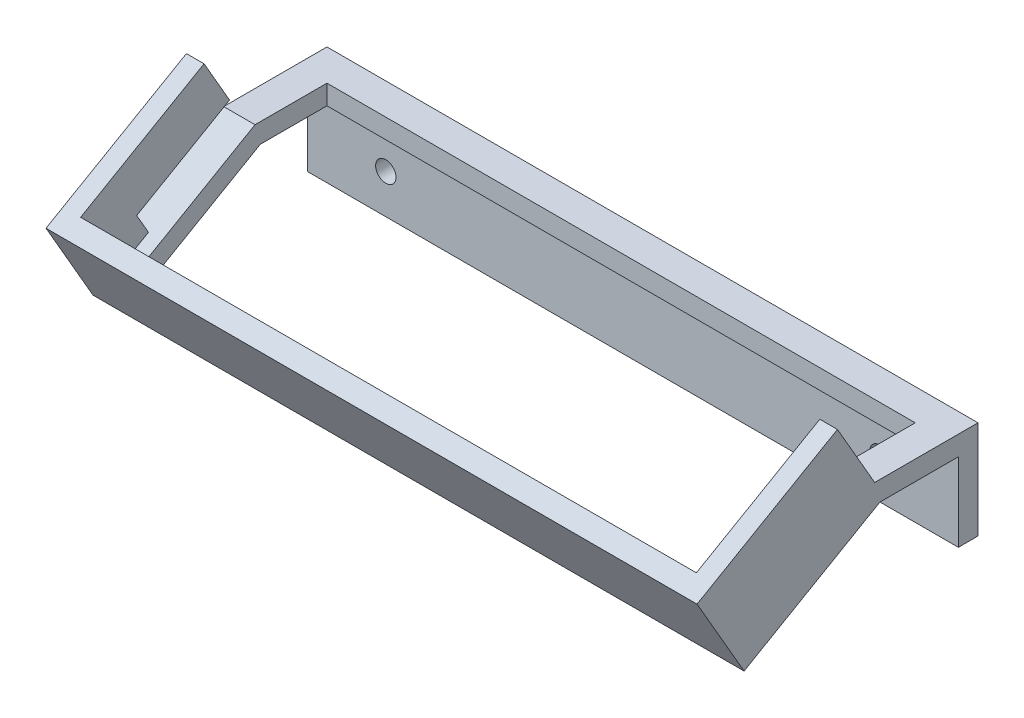
ISO-10303-21;
HEADER;
FILE_DESCRIPTION(('STEP AP214'),'2;1');
FILE_NAME('part.step','',(''),(''),'','','');
FILE_SCHEMA(('AUTOMOTIVE_DESIGN { 1 0 10303 214 1 1 1 1 }'));
ENDSEC;
DATA;
#1=APPLICATION_CONTEXT('core data for automotive mechanical design processes');
#2=APPLICATION_PROTOCOL_DEFINITION('international standard','automotive_design',2000,#1);
#3=PRODUCT_CONTEXT('',#1,'mechanical');
#4=PRODUCT('Part','Part','',(#3));
#5=PRODUCT_RELATED_PRODUCT_CATEGORY('part','',(#4));
#6=PRODUCT_DEFINITION_FORMATION('','',#4);
#7=PRODUCT_DEFINITION_CONTEXT('part definition',#1,'design');
#8=PRODUCT_DEFINITION('design','',#6,#7);
#9=PRODUCT_DEFINITION_SHAPE('','',#8);
#10=(LENGTH_UNIT() NAMED_UNIT(*) SI_UNIT(.MILLI.,.METRE.));
#11=(NAMED_UNIT(*) PLANE_ANGLE_UNIT() SI_UNIT($,.RADIAN.));
#12=(NAMED_UNIT(*) SI_UNIT($,.STERADIAN.) SOLID_ANGLE_UNIT());
#13=UNCERTAINTY_MEASURE_WITH_UNIT(LENGTH_MEASURE(1.E-05),#10,'distance_accuracy_value','');
#14=(GEOMETRIC_REPRESENTATION_CONTEXT(3) GLOBAL_UNCERTAINTY_ASSIGNED_CONTEXT((#13)) GLOBAL_UNIT_ASSIGNED_CONTEXT((#10,
#11,#12)) REPRESENTATION_CONTEXT('',''));
#15=CARTESIAN_POINT('',(0.,0.,0.));
#16=DIRECTION('',(0.,0.,1.));
#17=DIRECTION('',(1.,0.,0.));
#18=AXIS2_PLACEMENT_3D('',#15,#16,#17);
#19=CARTESIAN_POINT('',(83.,25.,-5.));
#20=DIRECTION('',(0.,-1.,0.));
#21=DIRECTION('',(0.,0.,-1.));
#22=AXIS2_PLACEMENT_3D('',#19,#20,#21);
#23=PLANE('',#22);
#24=DIRECTION('',(0.,0.,1.));
#25=VECTOR('',#24,1.);
#26=CARTESIAN_POINT('',(75.,25.,0.));
#27=LINE('',#26,#25);
#28=CARTESIAN_POINT('',(75.,25.,3.));
#29=VERTEX_POINT('',#28);
#30=CARTESIAN_POINT('',(75.,25.,21.3397459621556));
#31=VERTEX_POINT('',#30);
#32=EDGE_CURVE('E372',#29,#31,#27,.T.);
#33=ORIENTED_EDGE('',*,*,#32,.T.);
#34=DIRECTION('',(-1.,0.,0.));
#35=VECTOR('',#34,1.);
#36=CARTESIAN_POINT('',(83.,25.,21.3397459621556));
#37=LINE('',#36,#35);
#38=CARTESIAN_POINT('',(78.5,25.,21.3397459621556));
#39=VERTEX_POINT('',#38);
#40=EDGE_CURVE('E255',#39,#31,#37,.T.);
#41=ORIENTED_EDGE('',*,*,#40,.F.);
#42=CARTESIAN_POINT('',(83.,25.,21.3397459621556));
#43=VERTEX_POINT('',#42);
#44=EDGE_CURVE('E256',#43,#39,#37,.T.);
#45=ORIENTED_EDGE('',*,*,#44,.F.);
#46=DIRECTION('',(0.,0.,1.));
#47=VECTOR('',#46,1.);
#48=CARTESIAN_POINT('',(83.,25.,-5.));
#49=LINE('',#48,#47);
#50=CARTESIAN_POINT('',(83.,25.,-5.));
#51=VERTEX_POINT('',#50);
#52=EDGE_CURVE('E295',#51,#43,#49,.T.);
#53=ORIENTED_EDGE('',*,*,#52,.F.);
#54=DIRECTION('',(-1.,0.,0.));
#55=VECTOR('',#54,1.);
#56=CARTESIAN_POINT('',(83.,25.,-5.));
#57=LINE('',#56,#55);
#58=CARTESIAN_POINT('',(-83.,25.,-5.));
#59=VERTEX_POINT('',#58);
#60=EDGE_CURVE('E215',#51,#59,#57,.T.);
#61=ORIENTED_EDGE('',*,*,#60,.T.);
#62=DIRECTION('',(0.,0.,1.));
#63=VECTOR('',#62,1.);
#64=CARTESIAN_POINT('',(-83.,25.,-5.));
#65=LINE('',#64,#63);
#66=CARTESIAN_POINT('',(-83.,25.,21.3397459621556));
#67=VERTEX_POINT('',#66);
#68=EDGE_CURVE('E205',#59,#67,#65,.T.);
#69=ORIENTED_EDGE('',*,*,#68,.T.);
#70=DIRECTION('',(-1.,0.,0.));
#71=VECTOR('',#70,1.);
#72=CARTESIAN_POINT('',(-83.,25.,21.3397459621556));
#73=LINE('',#72,#71);
#74=CARTESIAN_POINT('',(-75.,25.,21.3397459621556));
#75=VERTEX_POINT('',#74);
#76=EDGE_CURVE('E185',#75,#67,#73,.T.);
#77=ORIENTED_EDGE('',*,*,#76,.F.);
#78=DIRECTION('',(0.,0.,1.));
#79=VECTOR('',#78,1.);
#80=CARTESIAN_POINT('',(-75.,25.,0.));
#81=LINE('',#80,#79);
#82=CARTESIAN_POINT('',(-75.,25.,3.00000000000003));
#83=VERTEX_POINT('',#82);
#84=EDGE_CURVE('E370',#83,#75,#81,.T.);
#85=ORIENTED_EDGE('',*,*,#84,.F.);
#86=DIRECTION('',(-1.,0.,0.));
#87=VECTOR('',#86,1.);
#88=CARTESIAN_POINT('',(0.,25.,3.00000000000002));
#89=LINE('',#88,#87);
#90=EDGE_CURVE('E53',#29,#83,#89,.T.);
#91=ORIENTED_EDGE('',*,*,#90,.F.);
#92=EDGE_LOOP('',(#33,#41,#45,#53,#61,#69,#77,#85,#91));
#93=FACE_BOUND('',#92,.T.);
#94=ADVANCED_FACE('F38',(#93),#23,.F.);
#95=CARTESIAN_POINT('',(83.,20.,20.));
#96=DIRECTION('',(0.,0.866025403784436,0.500000000000004));
#97=DIRECTION('',(0.,-0.500000000000004,0.866025403784436));
#98=AXIS2_PLACEMENT_3D('',#95,#96,#97);
#99=PLANE('',#98);
#100=DIRECTION('',(0.,-0.500000000000004,0.866025403784436));
#101=VECTOR('',#100,1.);
#102=CARTESIAN_POINT('',(-75.,20.,20.));
#103=LINE('',#102,#101);
#104=CARTESIAN_POINT('',(-75.,20.,20.));
#105=VERTEX_POINT('',#104);
#106=CARTESIAN_POINT('',(-75.,4.99987298107768,45.9809821167598));
#107=VERTEX_POINT('',#106);
#108=EDGE_CURVE('E61',#105,#107,#103,.T.);
#109=ORIENTED_EDGE('',*,*,#108,.T.);
#110=DIRECTION('',(1.,0.,0.));
#111=VECTOR('',#110,1.);
#112=CARTESIAN_POINT('',(-75.,4.99987298107768,45.9809821167598));
#113=LINE('',#112,#111);
#114=CARTESIAN_POINT('',(75.,4.99987298107768,45.9809821167598));
#115=VERTEX_POINT('',#114);
#116=EDGE_CURVE('E358',#107,#115,#113,.T.);
#117=ORIENTED_EDGE('',*,*,#116,.T.);
#118=DIRECTION('',(0.,-0.500000000000004,0.866025403784436));
#119=VECTOR('',#118,1.);
#120=CARTESIAN_POINT('',(75.,20.,20.));
#121=LINE('',#120,#119);
#122=CARTESIAN_POINT('',(75.,20.,20.));
#123=VERTEX_POINT('',#122);
#124=EDGE_CURVE('E379',#123,#115,#121,.T.);
#125=ORIENTED_EDGE('',*,*,#124,.F.);
#126=DIRECTION('',(-1.,0.,0.));
#127=VECTOR('',#126,1.);
#128=CARTESIAN_POINT('',(83.,20.,20.));
#129=LINE('',#128,#127);
#130=CARTESIAN_POINT('',(83.,20.,20.));
#131=VERTEX_POINT('',#130);
#132=EDGE_CURVE('E242',#131,#123,#129,.T.);
#133=ORIENTED_EDGE('',*,*,#132,.F.);
#134=DIRECTION('',(0.,0.500000000000004,-0.866025403784436));
#135=VECTOR('',#134,1.);
#136=CARTESIAN_POINT('',(83.,20.,20.));
#137=LINE('',#136,#135);
#138=CARTESIAN_POINT('',(83.,0.,54.6410161513771));
#139=VERTEX_POINT('',#138);
#140=EDGE_CURVE('E302',#139,#131,#137,.T.);
#141=ORIENTED_EDGE('',*,*,#140,.F.);
#142=DIRECTION('',(-1.,0.,0.));
#143=VECTOR('',#142,1.);
#144=CARTESIAN_POINT('',(83.,0.,54.6410161513771));
#145=LINE('',#144,#143);
#146=CARTESIAN_POINT('',(-83.,0.,54.6410161513771));
#147=VERTEX_POINT('',#146);
#148=EDGE_CURVE('E245',#139,#147,#145,.T.);
#149=ORIENTED_EDGE('',*,*,#148,.T.);
#150=DIRECTION('',(0.,0.500000000000004,-0.866025403784436));
#151=VECTOR('',#150,1.);
#152=CARTESIAN_POINT('',(-83.,20.,20.));
#153=LINE('',#152,#151);
#154=CARTESIAN_POINT('',(-83.,20.,20.));
#155=VERTEX_POINT('',#154);
#156=EDGE_CURVE('E226',#147,#155,#153,.T.);
#157=ORIENTED_EDGE('',*,*,#156,.T.);
#158=EDGE_CURVE('E241',#105,#155,#129,.T.);
#159=ORIENTED_EDGE('',*,*,#158,.F.);
#160=EDGE_LOOP('',(#109,#117,#125,#133,#141,#149,#157,#159));
#161=FACE_BOUND('',#160,.T.);
#162=ADVANCED_FACE('F330',(#161),#99,.F.);
#163=CARTESIAN_POINT('',(83.,20.,0.));
#164=DIRECTION('',(0.,1.,0.));
#165=DIRECTION('',(0.,0.,1.));
#166=AXIS2_PLACEMENT_3D('',#163,#164,#165);
#167=PLANE('',#166);
#168=DIRECTION('',(0.,0.,1.));
#169=VECTOR('',#168,1.);
#170=CARTESIAN_POINT('',(75.,20.,0.));
#171=LINE('',#170,#169);
#172=CARTESIAN_POINT('',(75.,20.,3.));
#173=VERTEX_POINT('',#172);
#174=EDGE_CURVE('E267',#173,#123,#171,.T.);
#175=ORIENTED_EDGE('',*,*,#174,.F.);
#176=DIRECTION('',(-1.,0.,0.));
#177=VECTOR('',#176,1.);
#178=CARTESIAN_POINT('',(83.,20.,3.));
#179=LINE('',#178,#177);
#180=CARTESIAN_POINT('',(-75.,20.,3.00000000000003));
#181=VERTEX_POINT('',#180);
#182=EDGE_CURVE('E264',#173,#181,#179,.T.);
#183=ORIENTED_EDGE('',*,*,#182,.T.);
#184=DIRECTION('',(0.,0.,1.));
#185=VECTOR('',#184,1.);
#186=CARTESIAN_POINT('',(-75.,20.,0.));
#187=LINE('',#186,#185);
#188=EDGE_CURVE('E262',#181,#105,#187,.T.);
#189=ORIENTED_EDGE('',*,*,#188,.T.);
#190=ORIENTED_EDGE('',*,*,#158,.T.);
#191=DIRECTION('',(0.,0.,-1.));
#192=VECTOR('',#191,1.);
#193=CARTESIAN_POINT('',(-83.,20.,0.));
#194=LINE('',#193,#192);
#195=CARTESIAN_POINT('',(-83.,20.,0.));
#196=VERTEX_POINT('',#195);
#197=EDGE_CURVE('E229',#155,#196,#194,.T.);
#198=ORIENTED_EDGE('',*,*,#197,.T.);
#199=DIRECTION('',(-1.,0.,0.));
#200=VECTOR('',#199,1.);
#201=CARTESIAN_POINT('',(83.,20.,0.));
#202=LINE('',#201,#200);
#203=CARTESIAN_POINT('',(83.,20.,0.));
#204=VERTEX_POINT('',#203);
#205=EDGE_CURVE('E237',#204,#196,#202,.T.);
#206=ORIENTED_EDGE('',*,*,#205,.F.);
#207=DIRECTION('',(0.,0.,-1.));
#208=VECTOR('',#207,1.);
#209=CARTESIAN_POINT('',(83.,20.,0.));
#210=LINE('',#209,#208);
#211=EDGE_CURVE('E304',#131,#204,#210,.T.);
#212=ORIENTED_EDGE('',*,*,#211,.F.);
#213=ORIENTED_EDGE('',*,*,#132,.T.);
#214=EDGE_LOOP('',(#175,#183,#189,#190,#198,#206,#212,#213));
#215=FACE_BOUND('',#214,.T.);
#216=ADVANCED_FACE('F326',(#215),#167,.F.);
#217=CARTESIAN_POINT('',(83.,25.,21.3397459621556));
#218=DIRECTION('',(0.,-0.866025403784436,-0.500000000000004));
#219=DIRECTION('',(0.,0.500000000000004,-0.866025403784436));
#220=AXIS2_PLACEMENT_3D('',#217,#218,#219);
#221=PLANE('',#220);
#222=DIRECTION('',(-1.,0.,0.));
#223=VECTOR('',#222,1.);
#224=CARTESIAN_POINT('',(-78.,11.3300000000001,45.0168805016222));
#225=LINE('',#224,#223);
#226=CARTESIAN_POINT('',(-78.5,11.3300000000001,45.0168805016222));
#227=VERTEX_POINT('',#226);
#228=CARTESIAN_POINT('',(-83.,11.3300000000001,45.0168805016222));
#229=VERTEX_POINT('',#228);
#230=EDGE_CURVE('E354',#227,#229,#225,.T.);
#231=ORIENTED_EDGE('',*,*,#230,.F.);
#232=DIRECTION('',(0.,0.500000000000004,-0.866025403784436));
#233=VECTOR('',#232,1.);
#234=CARTESIAN_POINT('',(-78.5,25.,21.3397459621556));
#235=LINE('',#234,#233);
#236=CARTESIAN_POINT('',(-78.5,6.8301270189222,52.810889132455));
#237=VERTEX_POINT('',#236);
#238=EDGE_CURVE('E199',#237,#227,#235,.T.);
#239=ORIENTED_EDGE('',*,*,#238,.F.);
#240=DIRECTION('',(-1.,0.,0.));
#241=VECTOR('',#240,1.);
#242=CARTESIAN_POINT('',(83.,6.8301270189222,52.810889132455));
#243=LINE('',#242,#241);
#244=CARTESIAN_POINT('',(78.5,6.83012701892221,52.810889132455));
#245=VERTEX_POINT('',#244);
#246=EDGE_CURVE('E253',#245,#237,#243,.T.);
#247=ORIENTED_EDGE('',*,*,#246,.F.);
#248=DIRECTION('',(0.,-0.500000000000004,0.866025403784436));
#249=VECTOR('',#248,1.);
#250=CARTESIAN_POINT('',(78.5,25.,21.3397459621556));
#251=LINE('',#250,#249);
#252=EDGE_CURVE('E390',#39,#245,#251,.T.);
#253=ORIENTED_EDGE('',*,*,#252,.F.);
#254=ORIENTED_EDGE('',*,*,#40,.T.);
#255=DIRECTION('',(0.,0.500000000000005,-0.866025403784436));
#256=VECTOR('',#255,1.);
#257=CARTESIAN_POINT('',(75.,25.,21.3397459621556));
#258=LINE('',#257,#256);
#259=CARTESIAN_POINT('',(75.,9.32999999999987,48.4809821167598));
#260=VERTEX_POINT('',#259);
#261=EDGE_CURVE('E361',#260,#31,#258,.T.);
#262=ORIENTED_EDGE('',*,*,#261,.F.);
#263=DIRECTION('',(1.,0.,0.));
#264=VECTOR('',#263,1.);
#265=CARTESIAN_POINT('',(-75.,9.32999999999987,48.4809821167598));
#266=LINE('',#265,#264);
#267=CARTESIAN_POINT('',(-75.,9.32999999999987,48.4809821167598));
#268=VERTEX_POINT('',#267);
#269=EDGE_CURVE('E352',#268,#260,#266,.T.);
#270=ORIENTED_EDGE('',*,*,#269,.F.);
#271=DIRECTION('',(0.,-0.500000000000005,0.866025403784436));
#272=VECTOR('',#271,1.);
#273=CARTESIAN_POINT('',(-75.,25.,21.3397459621556));
#274=LINE('',#273,#272);
#275=EDGE_CURVE('E193',#75,#268,#274,.T.);
#276=ORIENTED_EDGE('',*,*,#275,.F.);
#277=ORIENTED_EDGE('',*,*,#76,.T.);
#278=DIRECTION('',(0.,-0.499999999999997,0.86602540378444));
#279=VECTOR('',#278,1.);
#280=CARTESIAN_POINT('',(-83.,25.,21.3397459621556));
#281=LINE('',#280,#279);
#282=EDGE_CURVE('E189',#67,#229,#281,.T.);
#283=ORIENTED_EDGE('',*,*,#282,.T.);
#284=EDGE_LOOP('',(#231,#239,#247,#253,#254,#262,#270,#276,#277,#283));
#285=FACE_BOUND('',#284,.T.);
#286=ADVANCED_FACE('F188',(#285),#221,.F.);
#287=CARTESIAN_POINT('',(83.,6.8301270189222,52.810889132455));
#288=DIRECTION('',(0.,-0.500000000000004,0.866025403784436));
#289=DIRECTION('',(0.,-0.866025403784436,-0.500000000000004));
#290=AXIS2_PLACEMENT_3D('',#287,#288,#289);
#291=PLANE('',#290);
#292=DIRECTION('',(0.,-0.866025403784436,-0.500000000000005));
#293=VECTOR('',#292,1.);
#294=CARTESIAN_POINT('',(78.5,23.2846096908265,62.3108891324551));
#295=LINE('',#294,#293);
#296=CARTESIAN_POINT('',(78.5,23.2846096908265,62.3108891324551));
#297=VERTEX_POINT('',#296);
#298=EDGE_CURVE('E386',#297,#245,#295,.T.);
#299=ORIENTED_EDGE('',*,*,#298,.T.);
#300=ORIENTED_EDGE('',*,*,#246,.T.);
#301=DIRECTION('',(0.,-0.866025403784436,-0.500000000000005));
#302=VECTOR('',#301,1.);
#303=CARTESIAN_POINT('',(-78.5,23.2846096908265,62.3108891324551));
#304=LINE('',#303,#302);
#305=CARTESIAN_POINT('',(-78.5,23.2846096908265,62.3108891324551));
#306=VERTEX_POINT('',#305);
#307=EDGE_CURVE('E284',#306,#237,#304,.T.);
#308=ORIENTED_EDGE('',*,*,#307,.F.);
#309=DIRECTION('',(-1.,0.,0.));
#310=VECTOR('',#309,1.);
#311=CARTESIAN_POINT('',(83.,23.2846096908265,62.3108891324551));
#312=LINE('',#311,#310);
#313=EDGE_CURVE('E251',#297,#306,#312,.T.);
#314=ORIENTED_EDGE('',*,*,#313,.F.);
#315=EDGE_LOOP('',(#299,#300,#308,#314));
#316=FACE_BOUND('',#315,.T.);
#317=ADVANCED_FACE('F447',(#316),#291,.F.);
#318=CARTESIAN_POINT('',(83.,0.,0.));
#319=DIRECTION('',(0.,1.,0.));
#320=DIRECTION('',(0.,0.,1.));
#321=AXIS2_PLACEMENT_3D('',#318,#319,#320);
#322=PLANE('',#321);
#323=DIRECTION('',(0.,0.,-1.));
#324=VECTOR('',#323,1.);
#325=CARTESIAN_POINT('',(-83.,0.,0.));
#326=LINE('',#325,#324);
#327=CARTESIAN_POINT('',(-83.,0.,0.));
#328=VERTEX_POINT('',#327);
#329=CARTESIAN_POINT('',(-83.,0.,-5.));
#330=VERTEX_POINT('',#329);
#331=EDGE_CURVE('E221',#328,#330,#326,.T.);
#332=ORIENTED_EDGE('',*,*,#331,.T.);
#333=DIRECTION('',(-1.,0.,0.));
#334=VECTOR('',#333,1.);
#335=CARTESIAN_POINT('',(83.,0.,-5.));
#336=LINE('',#335,#334);
#337=CARTESIAN_POINT('',(83.,0.,-5.));
#338=VERTEX_POINT('',#337);
#339=EDGE_CURVE('E259',#338,#330,#336,.T.);
#340=ORIENTED_EDGE('',*,*,#339,.F.);
#341=DIRECTION('',(0.,0.,-1.));
#342=VECTOR('',#341,1.);
#343=CARTESIAN_POINT('',(83.,0.,0.));
#344=LINE('',#343,#342);
#345=CARTESIAN_POINT('',(83.,0.,0.));
#346=VERTEX_POINT('',#345);
#347=EDGE_CURVE('E233',#346,#338,#344,.T.);
#348=ORIENTED_EDGE('',*,*,#347,.F.);
#349=DIRECTION('',(-1.,0.,0.));
#350=VECTOR('',#349,1.);
#351=CARTESIAN_POINT('',(83.,0.,0.));
#352=LINE('',#351,#350);
#353=EDGE_CURVE('E234',#346,#328,#352,.T.);
#354=ORIENTED_EDGE('',*,*,#353,.T.);
#355=EDGE_LOOP('',(#332,#340,#348,#354));
#356=FACE_BOUND('',#355,.T.);
#357=ADVANCED_FACE('F40',(#356),#322,.F.);
#358=CARTESIAN_POINT('',(83.,0.,-5.));
#359=DIRECTION('',(0.,0.,1.));
#360=DIRECTION('',(1.,0.,0.));
#361=AXIS2_PLACEMENT_3D('',#358,#359,#360);
#362=PLANE('',#361);
#363=CARTESIAN_POINT('',(63.,10.,-5.));
#364=DIRECTION('',(0.,0.,-1.));
#365=DIRECTION('',(-1.,0.,0.));
#366=AXIS2_PLACEMENT_3D('',#363,#364,#365);
#367=CIRCLE('',#366,2.6);
#368=CARTESIAN_POINT('',(60.4,10.,-5.));
#369=VERTEX_POINT('',#368);
#370=EDGE_CURVE('E407',#369,#369,#367,.T.);
#371=ORIENTED_EDGE('',*,*,#370,.F.);
#372=EDGE_LOOP('',(#371));
#373=FACE_BOUND('',#372,.T.);
#374=CARTESIAN_POINT('',(-63.,10.,-5.));
#375=DIRECTION('',(0.,0.,-1.));
#376=DIRECTION('',(-1.,0.,0.));
#377=AXIS2_PLACEMENT_3D('',#374,#375,#376);
#378=CIRCLE('',#377,2.6);
#379=CARTESIAN_POINT('',(-65.6,10.,-5.));
#380=VERTEX_POINT('',#379);
#381=EDGE_CURVE('E404',#380,#380,#378,.T.);
#382=ORIENTED_EDGE('',*,*,#381,.F.);
#383=EDGE_LOOP('',(#382));
#384=FACE_BOUND('',#383,.T.);
#385=DIRECTION('',(0.,1.,0.));
#386=VECTOR('',#385,1.);
#387=CARTESIAN_POINT('',(-83.,0.,-5.));
#388=LINE('',#387,#386);
#389=EDGE_CURVE('E217',#330,#59,#388,.T.);
#390=ORIENTED_EDGE('',*,*,#389,.T.);
#391=ORIENTED_EDGE('',*,*,#60,.F.);
#392=DIRECTION('',(0.,1.,0.));
#393=VECTOR('',#392,1.);
#394=CARTESIAN_POINT('',(83.,0.,-5.));
#395=LINE('',#394,#393);
#396=EDGE_CURVE('E293',#338,#51,#395,.T.);
#397=ORIENTED_EDGE('',*,*,#396,.F.);
#398=ORIENTED_EDGE('',*,*,#339,.T.);
#399=EDGE_LOOP('',(#390,#391,#397,#398));
#400=FACE_BOUND('',#399,.T.);
#401=ADVANCED_FACE('F315',(#373,#384,#400),#362,.F.);
#402=CARTESIAN_POINT('',(83.,20.7846096908265,66.6410161513773));
#403=DIRECTION('',(0.,-0.866025403784436,-0.500000000000005));
#404=DIRECTION('',(0.,0.500000000000005,-0.866025403784436));
#405=AXIS2_PLACEMENT_3D('',#402,#403,#404);
#406=PLANE('',#405);
#407=DIRECTION('',(0.,-0.500000000000005,0.866025403784436));
#408=VECTOR('',#407,1.);
#409=CARTESIAN_POINT('',(-83.,20.7846096908265,66.6410161513773));
#410=LINE('',#409,#408);
#411=CARTESIAN_POINT('',(-83.,41.4544826719043,30.8397459621557));
#412=VERTEX_POINT('',#411);
#413=CARTESIAN_POINT('',(-83.,20.7846096908265,66.6410161513773));
#414=VERTEX_POINT('',#413);
#415=EDGE_CURVE('E216',#412,#414,#410,.T.);
#416=ORIENTED_EDGE('',*,*,#415,.T.);
#417=DIRECTION('',(-1.,0.,0.));
#418=VECTOR('',#417,1.);
#419=CARTESIAN_POINT('',(83.,20.7846096908265,66.6410161513773));
#420=LINE('',#419,#418);
#421=CARTESIAN_POINT('',(83.,20.7846096908265,66.6410161513773));
#422=VERTEX_POINT('',#421);
#423=EDGE_CURVE('E248',#422,#414,#420,.T.);
#424=ORIENTED_EDGE('',*,*,#423,.F.);
#425=DIRECTION('',(0.,-0.500000000000005,0.866025403784436));
#426=VECTOR('',#425,1.);
#427=CARTESIAN_POINT('',(83.,20.7846096908265,66.6410161513773));
#428=LINE('',#427,#426);
#429=CARTESIAN_POINT('',(83.,41.4544826719043,30.8397459621557));
#430=VERTEX_POINT('',#429);
#431=EDGE_CURVE('E298',#430,#422,#428,.T.);
#432=ORIENTED_EDGE('',*,*,#431,.F.);
#433=DIRECTION('',(-1.,0.,0.));
#434=VECTOR('',#433,1.);
#435=CARTESIAN_POINT('',(83.,41.4544826719043,30.8397459621557));
#436=LINE('',#435,#434);
#437=CARTESIAN_POINT('',(78.5,41.4544826719043,30.8397459621557));
#438=VERTEX_POINT('',#437);
#439=EDGE_CURVE('E392',#430,#438,#436,.T.);
#440=ORIENTED_EDGE('',*,*,#439,.T.);
#441=DIRECTION('',(0.,-0.500000000000004,0.866025403784436));
#442=VECTOR('',#441,1.);
#443=CARTESIAN_POINT('',(78.5,41.4544826719043,30.8397459621557));
#444=LINE('',#443,#442);
#445=EDGE_CURVE('E389',#438,#297,#444,.T.);
#446=ORIENTED_EDGE('',*,*,#445,.T.);
#447=ORIENTED_EDGE('',*,*,#313,.T.);
#448=DIRECTION('',(0.,0.500000000000004,-0.866025403784436));
#449=VECTOR('',#448,1.);
#450=CARTESIAN_POINT('',(-78.5,41.4544826719043,30.8397459621557));
#451=LINE('',#450,#449);
#452=CARTESIAN_POINT('',(-78.5,41.4544826719043,30.8397459621557));
#453=VERTEX_POINT('',#452);
#454=EDGE_CURVE('E198',#306,#453,#451,.T.);
#455=ORIENTED_EDGE('',*,*,#454,.T.);
#456=DIRECTION('',(-1.,0.,0.));
#457=VECTOR('',#456,1.);
#458=CARTESIAN_POINT('',(-83.,41.4544826719043,30.8397459621557));
#459=LINE('',#458,#457);
#460=EDGE_CURVE('E282',#453,#412,#459,.T.);
#461=ORIENTED_EDGE('',*,*,#460,.T.);
#462=EDGE_LOOP('',(#416,#424,#432,#440,#446,#447,#455,#461));
#463=FACE_BOUND('',#462,.T.);
#464=ADVANCED_FACE('F339',(#463),#406,.F.);
#465=CARTESIAN_POINT('',(83.,0.,54.6410161513771));
#466=DIRECTION('',(0.,0.500000000000004,-0.866025403784436));
#467=DIRECTION('',(0.,0.866025403784436,0.500000000000005));
#468=AXIS2_PLACEMENT_3D('',#465,#466,#467);
#469=PLANE('',#468);
#470=DIRECTION('',(0.,-0.866025403784436,-0.500000000000005));
#471=VECTOR('',#470,1.);
#472=CARTESIAN_POINT('',(-83.,0.,54.6410161513771));
#473=LINE('',#472,#471);
#474=EDGE_CURVE('E219',#414,#147,#473,.T.);
#475=ORIENTED_EDGE('',*,*,#474,.T.);
#476=ORIENTED_EDGE('',*,*,#148,.F.);
#477=DIRECTION('',(0.,-0.866025403784436,-0.500000000000005));
#478=VECTOR('',#477,1.);
#479=CARTESIAN_POINT('',(83.,0.,54.6410161513771));
#480=LINE('',#479,#478);
#481=EDGE_CURVE('E300',#422,#139,#480,.T.);
#482=ORIENTED_EDGE('',*,*,#481,.F.);
#483=ORIENTED_EDGE('',*,*,#423,.T.);
#484=EDGE_LOOP('',(#475,#476,#482,#483));
#485=FACE_BOUND('',#484,.T.);
#486=ADVANCED_FACE('F336',(#485),#469,.F.);
#487=CARTESIAN_POINT('',(83.,0.,0.));
#488=DIRECTION('',(0.,0.,-1.));
#489=DIRECTION('',(-1.,0.,0.));
#490=AXIS2_PLACEMENT_3D('',#487,#488,#489);
#491=PLANE('',#490);
#492=CARTESIAN_POINT('',(63.,10.,0.));
#493=DIRECTION('',(0.,0.,-1.));
#494=DIRECTION('',(-1.,0.,0.));
#495=AXIS2_PLACEMENT_3D('',#492,#493,#494);
#496=CIRCLE('',#495,2.6);
#497=CARTESIAN_POINT('',(60.4,10.,0.));
#498=VERTEX_POINT('',#497);
#499=EDGE_CURVE('E209',#498,#498,#496,.T.);
#500=ORIENTED_EDGE('',*,*,#499,.T.);
#501=EDGE_LOOP('',(#500));
#502=FACE_BOUND('',#501,.T.);
#503=CARTESIAN_POINT('',(-63.,10.,0.));
#504=DIRECTION('',(0.,0.,-1.));
#505=DIRECTION('',(-1.,0.,0.));
#506=AXIS2_PLACEMENT_3D('',#503,#504,#505);
#507=CIRCLE('',#506,2.6);
#508=CARTESIAN_POINT('',(-65.6,10.,0.));
#509=VERTEX_POINT('',#508);
#510=EDGE_CURVE('E401',#509,#509,#507,.T.);
#511=ORIENTED_EDGE('',*,*,#510,.T.);
#512=EDGE_LOOP('',(#511));
#513=FACE_BOUND('',#512,.T.);
#514=DIRECTION('',(0.,-1.,0.));
#515=VECTOR('',#514,1.);
#516=CARTESIAN_POINT('',(-83.,0.,0.));
#517=LINE('',#516,#515);
#518=EDGE_CURVE('E231',#196,#328,#517,.T.);
#519=ORIENTED_EDGE('',*,*,#518,.T.);
#520=ORIENTED_EDGE('',*,*,#353,.F.);
#521=DIRECTION('',(0.,-1.,0.));
#522=VECTOR('',#521,1.);
#523=CARTESIAN_POINT('',(83.,0.,0.));
#524=LINE('',#523,#522);
#525=EDGE_CURVE('E238',#204,#346,#524,.T.);
#526=ORIENTED_EDGE('',*,*,#525,.F.);
#527=ORIENTED_EDGE('',*,*,#205,.T.);
#528=EDGE_LOOP('',(#519,#520,#526,#527));
#529=FACE_BOUND('',#528,.T.);
#530=ADVANCED_FACE('F323',(#502,#513,#529),#491,.F.);
#531=CARTESIAN_POINT('',(83.,0.,0.));
#532=DIRECTION('',(1.,0.,0.));
#533=DIRECTION('',(0.,0.,-1.));
#534=AXIS2_PLACEMENT_3D('',#531,#532,#533);
#535=PLANE('',#534);
#536=DIRECTION('',(0.,-0.866025403784436,-0.500000000000005));
#537=VECTOR('',#536,1.);
#538=CARTESIAN_POINT('',(83.,41.4544826719043,30.8397459621557));
#539=LINE('',#538,#537);
#540=EDGE_CURVE('E381',#430,#43,#539,.T.);
#541=ORIENTED_EDGE('',*,*,#540,.F.);
#542=ORIENTED_EDGE('',*,*,#431,.T.);
#543=ORIENTED_EDGE('',*,*,#481,.T.);
#544=ORIENTED_EDGE('',*,*,#140,.T.);
#545=ORIENTED_EDGE('',*,*,#211,.T.);
#546=ORIENTED_EDGE('',*,*,#525,.T.);
#547=ORIENTED_EDGE('',*,*,#347,.T.);
#548=ORIENTED_EDGE('',*,*,#396,.T.);
#549=ORIENTED_EDGE('',*,*,#52,.T.);
#550=EDGE_LOOP('',(#541,#542,#543,#544,#545,#546,#547,#548,#549));
#551=FACE_BOUND('',#550,.T.);
#552=ADVANCED_FACE('F318',(#551),#535,.T.);
#553=CARTESIAN_POINT('',(-83.,0.,0.));
#554=DIRECTION('',(1.,0.,0.));
#555=DIRECTION('',(0.,0.,-1.));
#556=AXIS2_PLACEMENT_3D('',#553,#554,#555);
#557=PLANE('',#556);
#558=DIRECTION('',(0.,-0.866025403784436,-0.500000000000005));
#559=VECTOR('',#558,1.);
#560=CARTESIAN_POINT('',(-83.,41.4544826719043,30.8397459621557));
#561=LINE('',#560,#559);
#562=CARTESIAN_POINT('',(-83.,30.1961524227066,24.3397459621557));
#563=VERTEX_POINT('',#562);
#564=EDGE_CURVE('E274',#412,#563,#561,.T.);
#565=ORIENTED_EDGE('',*,*,#564,.T.);
#566=DIRECTION('',(0.,0.499999999999997,-0.86602540378444));
#567=VECTOR('',#566,1.);
#568=CARTESIAN_POINT('',(-83.,30.1961524227066,24.3397459621557));
#569=LINE('',#568,#567);
#570=CARTESIAN_POINT('',(-83.,16.5261524227067,48.0168805016222));
#571=VERTEX_POINT('',#570);
#572=EDGE_CURVE('E279',#571,#563,#569,.T.);
#573=ORIENTED_EDGE('',*,*,#572,.F.);
#574=DIRECTION('',(0.,0.866025403784439,0.5));
#575=VECTOR('',#574,1.);
#576=CARTESIAN_POINT('',(-83.,16.5261524227067,48.0168805016222));
#577=LINE('',#576,#575);
#578=EDGE_CURVE('E208',#229,#571,#577,.T.);
#579=ORIENTED_EDGE('',*,*,#578,.F.);
#580=ORIENTED_EDGE('',*,*,#282,.F.);
#581=ORIENTED_EDGE('',*,*,#68,.F.);
#582=ORIENTED_EDGE('',*,*,#389,.F.);
#583=ORIENTED_EDGE('',*,*,#331,.F.);
#584=ORIENTED_EDGE('',*,*,#518,.F.);
#585=ORIENTED_EDGE('',*,*,#197,.F.);
#586=ORIENTED_EDGE('',*,*,#156,.F.);
#587=ORIENTED_EDGE('',*,*,#474,.F.);
#588=ORIENTED_EDGE('',*,*,#415,.F.);
#589=EDGE_LOOP('',(#565,#573,#579,#580,#581,#582,#583,#584,#585,#586,#587,#588));
#590=FACE_BOUND('',#589,.T.);
#591=ADVANCED_FACE('F204',(#590),#557,.F.);
#592=CARTESIAN_POINT('',(-78.5,41.4544826719043,30.8397459621557));
#593=DIRECTION('',(-1.,0.,0.));
#594=DIRECTION('',(0.,0.,1.));
#595=AXIS2_PLACEMENT_3D('',#592,#593,#594);
#596=PLANE('',#595);
#597=DIRECTION('',(0.,0.866025403784438,0.5));
#598=VECTOR('',#597,1.);
#599=CARTESIAN_POINT('',(-78.5,27.7844826719043,54.5168805016222));
#600=LINE('',#599,#598);
#601=CARTESIAN_POINT('',(-78.5,16.5261524227067,48.0168805016222));
#602=VERTEX_POINT('',#601);
#603=EDGE_CURVE('E11',#227,#602,#600,.T.);
#604=ORIENTED_EDGE('',*,*,#603,.T.);
#605=DIRECTION('',(0.,0.499999999999997,-0.866025403784441));
#606=VECTOR('',#605,1.);
#607=CARTESIAN_POINT('',(-78.5,30.1961524227066,24.3397459621557));
#608=LINE('',#607,#606);
#609=CARTESIAN_POINT('',(-78.5,30.1961524227066,24.3397459621557));
#610=VERTEX_POINT('',#609);
#611=EDGE_CURVE('E347',#602,#610,#608,.T.);
#612=ORIENTED_EDGE('',*,*,#611,.T.);
#613=DIRECTION('',(0.,-0.866025403784436,-0.500000000000005));
#614=VECTOR('',#613,1.);
#615=CARTESIAN_POINT('',(-78.5,41.4544826719043,30.8397459621557));
#616=LINE('',#615,#614);
#617=EDGE_CURVE('E276',#453,#610,#616,.T.);
#618=ORIENTED_EDGE('',*,*,#617,.F.);
#619=ORIENTED_EDGE('',*,*,#454,.F.);
#620=ORIENTED_EDGE('',*,*,#307,.T.);
#621=ORIENTED_EDGE('',*,*,#238,.T.);
#622=EDGE_LOOP('',(#604,#612,#618,#619,#620,#621));
#623=FACE_BOUND('',#622,.T.);
#624=ADVANCED_FACE('F346',(#623),#596,.F.);
#625=CARTESIAN_POINT('',(-83.,41.4544826719043,30.8397459621557));
#626=DIRECTION('',(0.,-0.500000000000005,0.866025403784436));
#627=DIRECTION('',(0.,-0.866025403784436,-0.500000000000005));
#628=AXIS2_PLACEMENT_3D('',#625,#626,#627);
#629=PLANE('',#628);
#630=ORIENTED_EDGE('',*,*,#617,.T.);
#631=DIRECTION('',(-1.,0.,0.));
#632=VECTOR('',#631,1.);
#633=CARTESIAN_POINT('',(-83.,30.1961524227066,24.3397459621557));
#634=LINE('',#633,#632);
#635=EDGE_CURVE('E46',#610,#563,#634,.T.);
#636=ORIENTED_EDGE('',*,*,#635,.T.);
#637=ORIENTED_EDGE('',*,*,#564,.F.);
#638=ORIENTED_EDGE('',*,*,#460,.F.);
#639=EDGE_LOOP('',(#630,#636,#637,#638));
#640=FACE_BOUND('',#639,.T.);
#641=ADVANCED_FACE('F272',(#640),#629,.F.);
#642=CARTESIAN_POINT('',(83.,41.4544826719043,30.8397459621557));
#643=DIRECTION('',(0.,-0.500000000000005,0.866025403784436));
#644=DIRECTION('',(0.,-0.866025403784436,-0.500000000000005));
#645=AXIS2_PLACEMENT_3D('',#642,#643,#644);
#646=PLANE('',#645);
#647=ORIENTED_EDGE('',*,*,#44,.T.);
#648=DIRECTION('',(0.,-0.866025403784436,-0.500000000000005));
#649=VECTOR('',#648,1.);
#650=CARTESIAN_POINT('',(78.5,41.4544826719043,30.8397459621557));
#651=LINE('',#650,#649);
#652=EDGE_CURVE('E383',#438,#39,#651,.T.);
#653=ORIENTED_EDGE('',*,*,#652,.F.);
#654=ORIENTED_EDGE('',*,*,#439,.F.);
#655=ORIENTED_EDGE('',*,*,#540,.T.);
#656=EDGE_LOOP('',(#647,#653,#654,#655));
#657=FACE_BOUND('',#656,.T.);
#658=ADVANCED_FACE('F467',(#657),#646,.F.);
#659=CARTESIAN_POINT('',(78.5,41.4544826719043,30.8397459621557));
#660=DIRECTION('',(1.,0.,0.));
#661=DIRECTION('',(0.,0.,-1.));
#662=AXIS2_PLACEMENT_3D('',#659,#660,#661);
#663=PLANE('',#662);
#664=ORIENTED_EDGE('',*,*,#252,.T.);
#665=ORIENTED_EDGE('',*,*,#298,.F.);
#666=ORIENTED_EDGE('',*,*,#445,.F.);
#667=ORIENTED_EDGE('',*,*,#652,.T.);
#668=EDGE_LOOP('',(#664,#665,#666,#667));
#669=FACE_BOUND('',#668,.T.);
#670=ADVANCED_FACE('F468',(#669),#663,.F.);
#671=CARTESIAN_POINT('',(0.,19.,3.00000000000001));
#672=DIRECTION('',(0.,0.,-1.));
#673=DIRECTION('',(-1.,0.,0.));
#674=AXIS2_PLACEMENT_3D('',#671,#672,#673);
#675=PLANE('',#674);
#676=DIRECTION('',(0.,1.,0.));
#677=VECTOR('',#676,1.);
#678=CARTESIAN_POINT('',(75.,19.,3.));
#679=LINE('',#678,#677);
#680=EDGE_CURVE('E375',#173,#29,#679,.T.);
#681=ORIENTED_EDGE('',*,*,#680,.T.);
#682=ORIENTED_EDGE('',*,*,#90,.T.);
#683=DIRECTION('',(0.,1.,0.));
#684=VECTOR('',#683,1.);
#685=CARTESIAN_POINT('',(-75.,19.,3.00000000000003));
#686=LINE('',#685,#684);
#687=EDGE_CURVE('E374',#181,#83,#686,.T.);
#688=ORIENTED_EDGE('',*,*,#687,.F.);
#689=ORIENTED_EDGE('',*,*,#182,.F.);
#690=EDGE_LOOP('',(#681,#682,#688,#689));
#691=FACE_BOUND('',#690,.T.);
#692=ADVANCED_FACE('F471',(#691),#675,.F.);
#693=CARTESIAN_POINT('',(75.,19.,0.));
#694=DIRECTION('',(-1.,0.,0.));
#695=DIRECTION('',(0.,0.,1.));
#696=AXIS2_PLACEMENT_3D('',#693,#694,#695);
#697=PLANE('',#696);
#698=ORIENTED_EDGE('',*,*,#124,.T.);
#699=DIRECTION('',(0.,0.866025403784436,0.500000000000004));
#700=VECTOR('',#699,1.);
#701=CARTESIAN_POINT('',(75.,4.99987298107768,45.9809821167598));
#702=LINE('',#701,#700);
#703=EDGE_CURVE('E366',#115,#260,#702,.T.);
#704=ORIENTED_EDGE('',*,*,#703,.T.);
#705=ORIENTED_EDGE('',*,*,#261,.T.);
#706=ORIENTED_EDGE('',*,*,#32,.F.);
#707=ORIENTED_EDGE('',*,*,#680,.F.);
#708=ORIENTED_EDGE('',*,*,#174,.T.);
#709=EDGE_LOOP('',(#698,#704,#705,#706,#707,#708));
#710=FACE_BOUND('',#709,.T.);
#711=ADVANCED_FACE('F478',(#710),#697,.T.);
#712=CARTESIAN_POINT('',(-75.,19.,0.));
#713=DIRECTION('',(-1.,0.,0.));
#714=DIRECTION('',(0.,0.,1.));
#715=AXIS2_PLACEMENT_3D('',#712,#713,#714);
#716=PLANE('',#715);
#717=ORIENTED_EDGE('',*,*,#84,.T.);
#718=ORIENTED_EDGE('',*,*,#275,.T.);
#719=DIRECTION('',(0.,0.866025403784436,0.500000000000004));
#720=VECTOR('',#719,1.);
#721=CARTESIAN_POINT('',(-75.,4.99987298107768,45.9809821167598));
#722=LINE('',#721,#720);
#723=EDGE_CURVE('E360',#107,#268,#722,.T.);
#724=ORIENTED_EDGE('',*,*,#723,.F.);
#725=ORIENTED_EDGE('',*,*,#108,.F.);
#726=ORIENTED_EDGE('',*,*,#188,.F.);
#727=ORIENTED_EDGE('',*,*,#687,.T.);
#728=EDGE_LOOP('',(#717,#718,#724,#725,#726,#727));
#729=FACE_BOUND('',#728,.T.);
#730=ADVANCED_FACE('F479',(#729),#716,.F.);
#731=CARTESIAN_POINT('',(-75.,4.99987298107768,45.9809821167598));
#732=DIRECTION('',(0.,-0.500000000000004,0.866025403784436));
#733=DIRECTION('',(0.,-0.866025403784436,-0.500000000000004));
#734=AXIS2_PLACEMENT_3D('',#731,#732,#733);
#735=PLANE('',#734);
#736=ORIENTED_EDGE('',*,*,#269,.T.);
#737=ORIENTED_EDGE('',*,*,#703,.F.);
#738=ORIENTED_EDGE('',*,*,#116,.F.);
#739=ORIENTED_EDGE('',*,*,#723,.T.);
#740=EDGE_LOOP('',(#736,#737,#738,#739));
#741=FACE_BOUND('',#740,.T.);
#742=ADVANCED_FACE('F482',(#741),#735,.F.);
#743=CARTESIAN_POINT('',(-78.,16.5261524227067,48.0168805016222));
#744=DIRECTION('',(0.,-0.5,0.866025403784438));
#745=DIRECTION('',(0.,-0.866025403784438,-0.5));
#746=AXIS2_PLACEMENT_3D('',#743,#744,#745);
#747=PLANE('',#746);
#748=ORIENTED_EDGE('',*,*,#230,.T.);
#749=ORIENTED_EDGE('',*,*,#578,.T.);
#750=DIRECTION('',(-1.,0.,0.));
#751=VECTOR('',#750,1.);
#752=CARTESIAN_POINT('',(-78.,16.5261524227067,48.0168805016222));
#753=LINE('',#752,#751);
#754=EDGE_CURVE('E350',#602,#571,#753,.T.);
#755=ORIENTED_EDGE('',*,*,#754,.F.);
#756=ORIENTED_EDGE('',*,*,#603,.F.);
#757=EDGE_LOOP('',(#748,#749,#755,#756));
#758=FACE_BOUND('',#757,.T.);
#759=ADVANCED_FACE('F433',(#758),#747,.F.);
#760=CARTESIAN_POINT('',(-78.,30.1961524227066,24.3397459621557));
#761=DIRECTION('',(0.,0.86602540378444,0.499999999999997));
#762=DIRECTION('',(0.,-0.499999999999997,0.866025403784441));
#763=AXIS2_PLACEMENT_3D('',#760,#761,#762);
#764=PLANE('',#763);
#765=ORIENTED_EDGE('',*,*,#754,.T.);
#766=ORIENTED_EDGE('',*,*,#572,.T.);
#767=ORIENTED_EDGE('',*,*,#635,.F.);
#768=ORIENTED_EDGE('',*,*,#611,.F.);
#769=EDGE_LOOP('',(#765,#766,#767,#768));
#770=FACE_BOUND('',#769,.T.);
#771=ADVANCED_FACE('F427',(#770),#764,.F.);
#772=CARTESIAN_POINT('',(-63.,10.,0.));
#773=DIRECTION('',(0.,0.,-1.));
#774=DIRECTION('',(-1.,0.,0.));
#775=AXIS2_PLACEMENT_3D('',#772,#773,#774);
#776=CYLINDRICAL_SURFACE('',#775,2.6);
#777=ORIENTED_EDGE('',*,*,#510,.F.);
#778=EDGE_LOOP('',(#777));
#779=FACE_BOUND('',#778,.T.);
#780=ORIENTED_EDGE('',*,*,#381,.T.);
#781=EDGE_LOOP('',(#780));
#782=FACE_BOUND('',#781,.T.);
#783=ADVANCED_FACE('F418',(#779,#782),#776,.F.);
#784=CARTESIAN_POINT('',(63.,10.,0.));
#785=DIRECTION('',(0.,0.,-1.));
#786=DIRECTION('',(-1.,0.,0.));
#787=AXIS2_PLACEMENT_3D('',#784,#785,#786);
#788=CYLINDRICAL_SURFACE('',#787,2.6);
#789=ORIENTED_EDGE('',*,*,#499,.F.);
#790=EDGE_LOOP('',(#789));
#791=FACE_BOUND('',#790,.T.);
#792=ORIENTED_EDGE('',*,*,#370,.T.);
#793=EDGE_LOOP('',(#792));
#794=FACE_BOUND('',#793,.T.);
#795=ADVANCED_FACE('F415',(#791,#794),#788,.F.);
#796=CLOSED_SHELL('',(#94,#162,#216,#286,#317,#357,#401,#464,#486,#530,#552,#591,#624,#641,#658,
#670,#692,#711,#730,#742,#759,#771,#783,#795));
#797=MANIFOLD_SOLID_BREP('B2',#796);
#798=ADVANCED_BREP_SHAPE_REPRESENTATION('',(#18,#797),#14);
#799=SHAPE_DEFINITION_REPRESENTATION(#9,#798);
ENDSEC;
END-ISO-10303-21;
